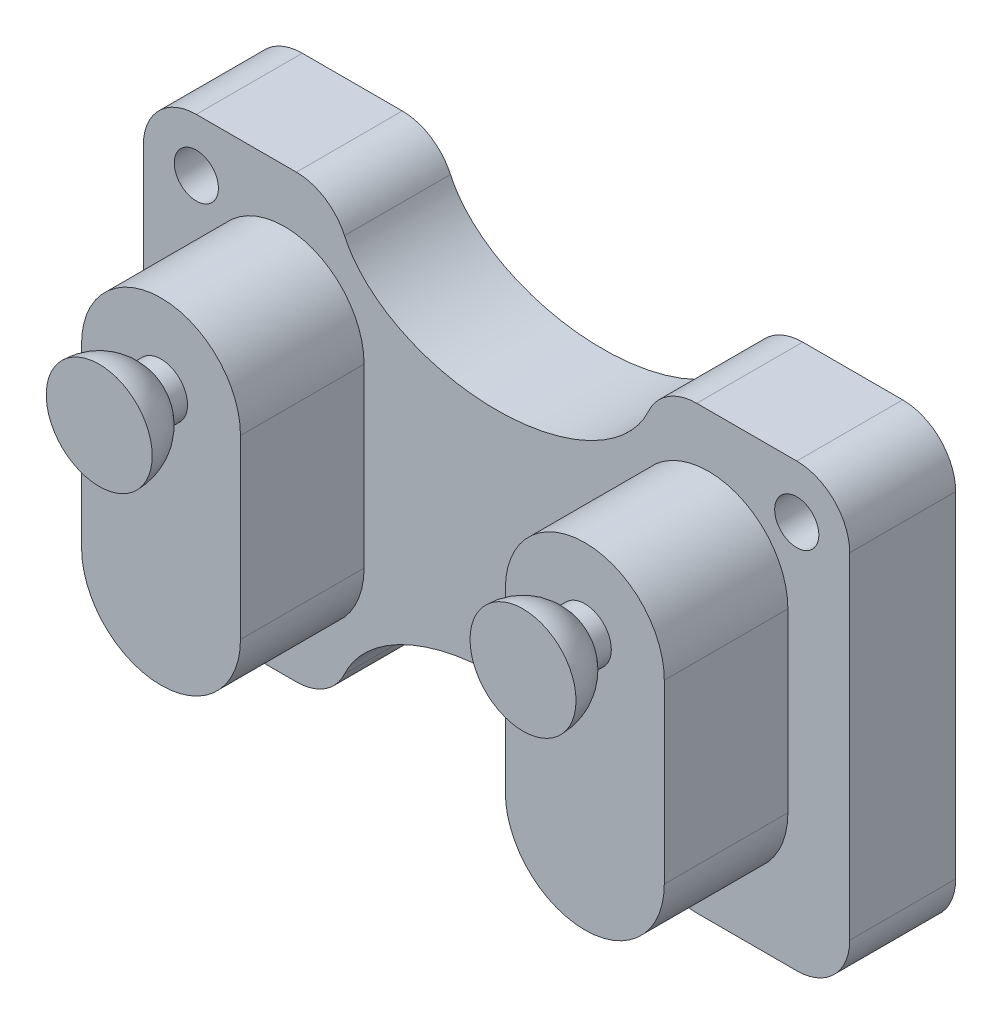
ISO-10303-21;
HEADER;
FILE_DESCRIPTION(('STEP AP214'),'2;1');
FILE_NAME('part.step','',(''),(''),'','','');
FILE_SCHEMA(('AUTOMOTIVE_DESIGN { 1 0 10303 214 1 1 1 1 }'));
ENDSEC;
DATA;
#1=APPLICATION_CONTEXT('core data for automotive mechanical design processes');
#2=APPLICATION_PROTOCOL_DEFINITION('international standard','automotive_design',2000,#1);
#3=PRODUCT_CONTEXT('',#1,'mechanical');
#4=PRODUCT('Part','Part','',(#3));
#5=PRODUCT_RELATED_PRODUCT_CATEGORY('part','',(#4));
#6=PRODUCT_DEFINITION_FORMATION('','',#4);
#7=PRODUCT_DEFINITION_CONTEXT('part definition',#1,'design');
#8=PRODUCT_DEFINITION('design','',#6,#7);
#9=PRODUCT_DEFINITION_SHAPE('','',#8);
#10=(LENGTH_UNIT() NAMED_UNIT(*) SI_UNIT(.MILLI.,.METRE.));
#11=(NAMED_UNIT(*) PLANE_ANGLE_UNIT() SI_UNIT($,.RADIAN.));
#12=(NAMED_UNIT(*) SI_UNIT($,.STERADIAN.) SOLID_ANGLE_UNIT());
#13=UNCERTAINTY_MEASURE_WITH_UNIT(LENGTH_MEASURE(1.E-05),#10,'distance_accuracy_value','');
#14=(GEOMETRIC_REPRESENTATION_CONTEXT(3) GLOBAL_UNCERTAINTY_ASSIGNED_CONTEXT((#13)) GLOBAL_UNIT_ASSIGNED_CONTEXT((#10,
#11,#12)) REPRESENTATION_CONTEXT('',''));
#15=CARTESIAN_POINT('',(0.,0.,0.));
#16=DIRECTION('',(0.,0.,1.));
#17=DIRECTION('',(1.,0.,0.));
#18=AXIS2_PLACEMENT_3D('',#15,#16,#17);
#19=CARTESIAN_POINT('',(0.,25.,6.));
#20=DIRECTION('',(0.,-1.,0.));
#21=DIRECTION('',(0.,0.,-1.));
#22=AXIS2_PLACEMENT_3D('',#19,#20,#21);
#23=PLANE('',#22);
#24=DIRECTION('',(-1.,0.,0.));
#25=VECTOR('',#24,1.);
#26=CARTESIAN_POINT('',(0.,25.,6.));
#27=LINE('',#26,#25);
#28=CARTESIAN_POINT('',(8.6641411243451,25.,6.));
#29=VERTEX_POINT('',#28);
#30=CARTESIAN_POINT('',(3.00000000000001,25.,6.));
#31=VERTEX_POINT('',#30);
#32=EDGE_CURVE('E284',#29,#31,#27,.T.);
#33=ORIENTED_EDGE('',*,*,#32,.F.);
#34=DIRECTION('',(0.,0.,-1.));
#35=VECTOR('',#34,1.);
#36=CARTESIAN_POINT('',(8.6641411243451,25.,0.));
#37=LINE('',#36,#35);
#38=CARTESIAN_POINT('',(8.6641411243451,25.,0.));
#39=VERTEX_POINT('',#38);
#40=EDGE_CURVE('E11',#29,#39,#37,.T.);
#41=ORIENTED_EDGE('',*,*,#40,.T.);
#42=DIRECTION('',(-1.,0.,0.));
#43=VECTOR('',#42,1.);
#44=CARTESIAN_POINT('',(0.,25.,0.));
#45=LINE('',#44,#43);
#46=CARTESIAN_POINT('',(3.00000000000001,25.,0.));
#47=VERTEX_POINT('',#46);
#48=EDGE_CURVE('E297',#39,#47,#45,.T.);
#49=ORIENTED_EDGE('',*,*,#48,.T.);
#50=DIRECTION('',(0.,0.,-1.));
#51=VECTOR('',#50,1.);
#52=CARTESIAN_POINT('',(3.00000000000001,25.,6.));
#53=LINE('',#52,#51);
#54=EDGE_CURVE('E342',#47,#31,#53,.F.);
#55=ORIENTED_EDGE('',*,*,#54,.T.);
#56=EDGE_LOOP('',(#33,#41,#49,#55));
#57=FACE_BOUND('',#56,.T.);
#58=ADVANCED_FACE('F32',(#57),#23,.F.);
#59=CARTESIAN_POINT('',(37.,25.,0.));
#60=VERTEX_POINT('',#59);
#61=CARTESIAN_POINT('',(31.3358588756549,25.,0.));
#62=VERTEX_POINT('',#61);
#63=EDGE_CURVE('E277',#60,#62,#45,.T.);
#64=ORIENTED_EDGE('',*,*,#63,.T.);
#65=DIRECTION('',(0.,0.,-1.));
#66=VECTOR('',#65,1.);
#67=CARTESIAN_POINT('',(31.3358588756549,25.,6.));
#68=LINE('',#67,#66);
#69=CARTESIAN_POINT('',(31.3358588756549,25.,6.));
#70=VERTEX_POINT('',#69);
#71=EDGE_CURVE('E55',#62,#70,#68,.F.);
#72=ORIENTED_EDGE('',*,*,#71,.T.);
#73=CARTESIAN_POINT('',(37.,25.,6.));
#74=VERTEX_POINT('',#73);
#75=EDGE_CURVE('E285',#74,#70,#27,.T.);
#76=ORIENTED_EDGE('',*,*,#75,.F.);
#77=DIRECTION('',(0.,0.,-1.));
#78=VECTOR('',#77,1.);
#79=CARTESIAN_POINT('',(37.,25.,6.));
#80=LINE('',#79,#78);
#81=EDGE_CURVE('E345',#74,#60,#80,.T.);
#82=ORIENTED_EDGE('',*,*,#81,.T.);
#83=EDGE_LOOP('',(#64,#72,#76,#82));
#84=FACE_BOUND('',#83,.T.);
#85=ADVANCED_FACE('F401',(#84),#23,.F.);
#86=CARTESIAN_POINT('',(0.,0.,6.));
#87=DIRECTION('',(0.,1.,0.));
#88=DIRECTION('',(0.,0.,1.));
#89=AXIS2_PLACEMENT_3D('',#86,#87,#88);
#90=PLANE('',#89);
#91=DIRECTION('',(1.,0.,0.));
#92=VECTOR('',#91,1.);
#93=CARTESIAN_POINT('',(0.,0.,0.));
#94=LINE('',#93,#92);
#95=CARTESIAN_POINT('',(3.,0.,0.));
#96=VERTEX_POINT('',#95);
#97=CARTESIAN_POINT('',(8.6641411243451,0.,0.));
#98=VERTEX_POINT('',#97);
#99=EDGE_CURVE('E291',#96,#98,#94,.T.);
#100=ORIENTED_EDGE('',*,*,#99,.T.);
#101=DIRECTION('',(0.,0.,1.));
#102=VECTOR('',#101,1.);
#103=CARTESIAN_POINT('',(8.6641411243451,0.,6.));
#104=LINE('',#103,#102);
#105=CARTESIAN_POINT('',(8.6641411243451,0.,6.));
#106=VERTEX_POINT('',#105);
#107=EDGE_CURVE('E366',#98,#106,#104,.T.);
#108=ORIENTED_EDGE('',*,*,#107,.T.);
#109=DIRECTION('',(1.,0.,0.));
#110=VECTOR('',#109,1.);
#111=CARTESIAN_POINT('',(0.,0.,6.));
#112=LINE('',#111,#110);
#113=CARTESIAN_POINT('',(3.,0.,6.));
#114=VERTEX_POINT('',#113);
#115=EDGE_CURVE('E278',#114,#106,#112,.T.);
#116=ORIENTED_EDGE('',*,*,#115,.F.);
#117=DIRECTION('',(0.,0.,-1.));
#118=VECTOR('',#117,1.);
#119=CARTESIAN_POINT('',(3.,0.,6.));
#120=LINE('',#119,#118);
#121=EDGE_CURVE('E311',#114,#96,#120,.T.);
#122=ORIENTED_EDGE('',*,*,#121,.T.);
#123=EDGE_LOOP('',(#100,#108,#116,#122));
#124=FACE_BOUND('',#123,.T.);
#125=ADVANCED_FACE('F509',(#124),#90,.F.);
#126=CARTESIAN_POINT('',(0.,0.,6.));
#127=DIRECTION('',(0.,0.,-1.));
#128=DIRECTION('',(-1.,0.,0.));
#129=AXIS2_PLACEMENT_3D('',#126,#127,#128);
#130=PLANE('',#129);
#131=CARTESIAN_POINT('',(37.0000000000003,21.9999999999998,6.));
#132=DIRECTION('',(0.,0.,-1.));
#133=DIRECTION('',(-1.,0.,0.));
#134=AXIS2_PLACEMENT_3D('',#131,#132,#133);
#135=CIRCLE('',#134,1.25);
#136=CARTESIAN_POINT('',(35.7500000000003,21.9999999999998,6.));
#137=VERTEX_POINT('',#136);
#138=EDGE_CURVE('E714',#137,#137,#135,.T.);
#139=ORIENTED_EDGE('',*,*,#138,.T.);
#140=EDGE_LOOP('',(#139));
#141=FACE_BOUND('',#140,.T.);
#142=CARTESIAN_POINT('',(3.00000000000001,22.,6.));
#143=DIRECTION('',(0.,0.,1.));
#144=DIRECTION('',(1.,0.,0.));
#145=AXIS2_PLACEMENT_3D('',#142,#143,#144);
#146=CIRCLE('',#145,1.25);
#147=CARTESIAN_POINT('',(4.25000000000001,22.,6.));
#148=VERTEX_POINT('',#147);
#149=EDGE_CURVE('E718',#148,#148,#146,.T.);
#150=ORIENTED_EDGE('',*,*,#149,.F.);
#151=EDGE_LOOP('',(#150));
#152=FACE_BOUND('',#151,.T.);
#153=ORIENTED_EDGE('',*,*,#75,.T.);
#154=CARTESIAN_POINT('',(31.3358588756549,22.,6.));
#155=DIRECTION('',(0.,0.,-1.));
#156=DIRECTION('',(-1.,0.,0.));
#157=AXIS2_PLACEMENT_3D('',#154,#155,#156);
#158=CIRCLE('',#157,3.);
#159=CARTESIAN_POINT('',(28.6080765639452,23.24868076782,6.));
#160=VERTEX_POINT('',#159);
#161=EDGE_CURVE('E40',#70,#160,#158,.F.);
#162=ORIENTED_EDGE('',*,*,#161,.T.);
#163=CARTESIAN_POINT('',(20.,25.,6.));
#164=DIRECTION('',(0.,0.,-1.));
#165=DIRECTION('',(-1.,0.,0.));
#166=AXIS2_PLACEMENT_3D('',#163,#164,#165);
#167=ELLIPSE('',#166,9.,6.);
#168=CARTESIAN_POINT('',(11.3919234360548,23.24868076782,6.));
#169=VERTEX_POINT('',#168);
#170=EDGE_CURVE('E387',#160,#169,#167,.T.);
#171=ORIENTED_EDGE('',*,*,#170,.T.);
#172=CARTESIAN_POINT('',(8.6641411243451,22.,6.));
#173=DIRECTION('',(0.,0.,-1.));
#174=DIRECTION('',(-1.,0.,0.));
#175=AXIS2_PLACEMENT_3D('',#172,#173,#174);
#176=CIRCLE('',#175,3.);
#177=EDGE_CURVE('E47',#169,#29,#176,.F.);
#178=ORIENTED_EDGE('',*,*,#177,.T.);
#179=ORIENTED_EDGE('',*,*,#32,.T.);
#180=CARTESIAN_POINT('',(3.00000000000001,22.,6.));
#181=DIRECTION('',(0.,0.,-1.));
#182=DIRECTION('',(-1.,0.,0.));
#183=AXIS2_PLACEMENT_3D('',#180,#181,#182);
#184=CIRCLE('',#183,3.);
#185=CARTESIAN_POINT('',(0.,22.,6.));
#186=VERTEX_POINT('',#185);
#187=EDGE_CURVE('E329',#31,#186,#184,.F.);
#188=ORIENTED_EDGE('',*,*,#187,.T.);
#189=DIRECTION('',(0.,-1.,0.));
#190=VECTOR('',#189,1.);
#191=CARTESIAN_POINT('',(0.,0.,6.));
#192=LINE('',#191,#190);
#193=CARTESIAN_POINT('',(0.,3.,6.));
#194=VERTEX_POINT('',#193);
#195=EDGE_CURVE('E273',#186,#194,#192,.T.);
#196=ORIENTED_EDGE('',*,*,#195,.T.);
#197=CARTESIAN_POINT('',(3.,3.,6.));
#198=DIRECTION('',(0.,0.,-1.));
#199=DIRECTION('',(-1.,0.,0.));
#200=AXIS2_PLACEMENT_3D('',#197,#198,#199);
#201=CIRCLE('',#200,3.);
#202=EDGE_CURVE('E335',#194,#114,#201,.F.);
#203=ORIENTED_EDGE('',*,*,#202,.T.);
#204=ORIENTED_EDGE('',*,*,#115,.T.);
#205=CARTESIAN_POINT('',(8.6641411243451,2.99999999999995,6.));
#206=DIRECTION('',(0.,0.,-1.));
#207=DIRECTION('',(-1.,0.,0.));
#208=AXIS2_PLACEMENT_3D('',#205,#206,#207);
#209=CIRCLE('',#208,3.);
#210=CARTESIAN_POINT('',(11.3919234360548,1.75131923218001,6.));
#211=VERTEX_POINT('',#210);
#212=EDGE_CURVE('E362',#106,#211,#209,.F.);
#213=ORIENTED_EDGE('',*,*,#212,.T.);
#214=CARTESIAN_POINT('',(20.,0.,6.));
#215=DIRECTION('',(0.,0.,1.));
#216=DIRECTION('',(-1.,0.,0.));
#217=AXIS2_PLACEMENT_3D('',#214,#215,#216);
#218=ELLIPSE('',#217,9.,6.);
#219=CARTESIAN_POINT('',(28.6080765639452,1.75131923218001,6.));
#220=VERTEX_POINT('',#219);
#221=EDGE_CURVE('E394',#220,#211,#218,.T.);
#222=ORIENTED_EDGE('',*,*,#221,.F.);
#223=CARTESIAN_POINT('',(31.3358588756549,2.99999999999996,6.));
#224=DIRECTION('',(0.,0.,-1.));
#225=DIRECTION('',(-1.,0.,0.));
#226=AXIS2_PLACEMENT_3D('',#223,#224,#225);
#227=CIRCLE('',#226,3.);
#228=CARTESIAN_POINT('',(31.3358588756549,0.,6.));
#229=VERTEX_POINT('',#228);
#230=EDGE_CURVE('E364',#220,#229,#227,.F.);
#231=ORIENTED_EDGE('',*,*,#230,.T.);
#232=CARTESIAN_POINT('',(37.,0.,6.));
#233=VERTEX_POINT('',#232);
#234=EDGE_CURVE('E276',#229,#233,#112,.T.);
#235=ORIENTED_EDGE('',*,*,#234,.T.);
#236=CARTESIAN_POINT('',(37.,3.,6.));
#237=DIRECTION('',(0.,0.,-1.));
#238=DIRECTION('',(-1.,0.,0.));
#239=AXIS2_PLACEMENT_3D('',#236,#237,#238);
#240=CIRCLE('',#239,3.);
#241=CARTESIAN_POINT('',(40.,3.,6.));
#242=VERTEX_POINT('',#241);
#243=EDGE_CURVE('E333',#233,#242,#240,.F.);
#244=ORIENTED_EDGE('',*,*,#243,.T.);
#245=DIRECTION('',(0.,1.,0.));
#246=VECTOR('',#245,1.);
#247=CARTESIAN_POINT('',(40.,0.,6.));
#248=LINE('',#247,#246);
#249=CARTESIAN_POINT('',(40.,22.,6.));
#250=VERTEX_POINT('',#249);
#251=EDGE_CURVE('E281',#242,#250,#248,.T.);
#252=ORIENTED_EDGE('',*,*,#251,.T.);
#253=CARTESIAN_POINT('',(37.,22.,6.));
#254=DIRECTION('',(0.,0.,-1.));
#255=DIRECTION('',(-1.,0.,0.));
#256=AXIS2_PLACEMENT_3D('',#253,#254,#255);
#257=CIRCLE('',#256,3.);
#258=EDGE_CURVE('E331',#250,#74,#257,.F.);
#259=ORIENTED_EDGE('',*,*,#258,.T.);
#260=EDGE_LOOP('',(#153,#162,#171,#178,#179,#188,#196,#203,#204,#213,#222,#231,#235,#244,#252,#259));
#261=FACE_BOUND('',#260,.T.);
#262=DIRECTION('',(0.,1.,0.));
#263=VECTOR('',#262,1.);
#264=CARTESIAN_POINT('',(27.5000000000002,17.4999999999999,6.));
#265=LINE('',#264,#263);
#266=CARTESIAN_POINT('',(27.5000000000001,7.49999999999991,6.));
#267=VERTEX_POINT('',#266);
#268=CARTESIAN_POINT('',(27.5000000000002,17.4999999999999,6.));
#269=VERTEX_POINT('',#268);
#270=EDGE_CURVE('E227',#267,#269,#265,.T.);
#271=ORIENTED_EDGE('',*,*,#270,.T.);
#272=CARTESIAN_POINT('',(32.0000000000002,17.4999999999999,6.));
#273=DIRECTION('',(0.,0.,-1.));
#274=DIRECTION('',(-1.,0.,0.));
#275=AXIS2_PLACEMENT_3D('',#272,#273,#274);
#276=CIRCLE('',#275,4.5);
#277=CARTESIAN_POINT('',(36.5000000000002,17.4999999999998,6.));
#278=VERTEX_POINT('',#277);
#279=EDGE_CURVE('E200',#269,#278,#276,.T.);
#280=ORIENTED_EDGE('',*,*,#279,.T.);
#281=DIRECTION('',(0.,-1.,0.));
#282=VECTOR('',#281,1.);
#283=CARTESIAN_POINT('',(36.5000000000002,17.4999999999998,6.));
#284=LINE('',#283,#282);
#285=CARTESIAN_POINT('',(36.5000000000001,7.49999999999979,6.));
#286=VERTEX_POINT('',#285);
#287=EDGE_CURVE('E216',#278,#286,#284,.T.);
#288=ORIENTED_EDGE('',*,*,#287,.T.);
#289=CARTESIAN_POINT('',(32.0000000000001,7.49999999999985,6.));
#290=DIRECTION('',(0.,0.,-1.));
#291=DIRECTION('',(-1.,0.,0.));
#292=AXIS2_PLACEMENT_3D('',#289,#290,#291);
#293=CIRCLE('',#292,4.5);
#294=EDGE_CURVE('E230',#286,#267,#293,.T.);
#295=ORIENTED_EDGE('',*,*,#294,.T.);
#296=EDGE_LOOP('',(#271,#280,#288,#295));
#297=FACE_BOUND('',#296,.T.);
#298=CARTESIAN_POINT('',(8.00000000000002,17.5,6.));
#299=DIRECTION('',(0.,0.,1.));
#300=DIRECTION('',(1.,0.,0.));
#301=AXIS2_PLACEMENT_3D('',#298,#299,#300);
#302=CIRCLE('',#301,4.5);
#303=CARTESIAN_POINT('',(12.5,17.5,6.));
#304=VERTEX_POINT('',#303);
#305=CARTESIAN_POINT('',(3.50000000000002,17.5,6.));
#306=VERTEX_POINT('',#305);
#307=EDGE_CURVE('E205',#304,#306,#302,.T.);
#308=ORIENTED_EDGE('',*,*,#307,.F.);
#309=DIRECTION('',(0.,1.,0.));
#310=VECTOR('',#309,1.);
#311=CARTESIAN_POINT('',(12.5,17.5,6.));
#312=LINE('',#311,#310);
#313=CARTESIAN_POINT('',(12.5,7.5,6.));
#314=VERTEX_POINT('',#313);
#315=EDGE_CURVE('E244',#314,#304,#312,.T.);
#316=ORIENTED_EDGE('',*,*,#315,.F.);
#317=CARTESIAN_POINT('',(8.00000000000003,7.5,6.));
#318=DIRECTION('',(0.,0.,1.));
#319=DIRECTION('',(1.,0.,0.));
#320=AXIS2_PLACEMENT_3D('',#317,#318,#319);
#321=CIRCLE('',#320,4.5);
#322=CARTESIAN_POINT('',(3.50000000000003,7.5,6.));
#323=VERTEX_POINT('',#322);
#324=EDGE_CURVE('E256',#323,#314,#321,.T.);
#325=ORIENTED_EDGE('',*,*,#324,.F.);
#326=DIRECTION('',(0.,-1.,0.));
#327=VECTOR('',#326,1.);
#328=CARTESIAN_POINT('',(3.50000000000002,17.5,6.));
#329=LINE('',#328,#327);
#330=EDGE_CURVE('E253',#306,#323,#329,.T.);
#331=ORIENTED_EDGE('',*,*,#330,.F.);
#332=EDGE_LOOP('',(#308,#316,#325,#331));
#333=FACE_BOUND('',#332,.T.);
#334=ADVANCED_FACE('F385',(#141,#152,#261,#297,#333),#130,.F.);
#335=CARTESIAN_POINT('',(0.,0.,6.));
#336=DIRECTION('',(1.,0.,0.));
#337=DIRECTION('',(0.,1.,0.));
#338=AXIS2_PLACEMENT_3D('',#335,#336,#337);
#339=PLANE('',#338);
#340=DIRECTION('',(0.,-1.,0.));
#341=VECTOR('',#340,1.);
#342=CARTESIAN_POINT('',(0.,0.,0.));
#343=LINE('',#342,#341);
#344=CARTESIAN_POINT('',(0.,22.,0.));
#345=VERTEX_POINT('',#344);
#346=CARTESIAN_POINT('',(0.,3.,0.));
#347=VERTEX_POINT('',#346);
#348=EDGE_CURVE('E272',#345,#347,#343,.T.);
#349=ORIENTED_EDGE('',*,*,#348,.T.);
#350=DIRECTION('',(0.,0.,-1.));
#351=VECTOR('',#350,1.);
#352=CARTESIAN_POINT('',(0.,3.,6.));
#353=LINE('',#352,#351);
#354=EDGE_CURVE('E327',#347,#194,#353,.F.);
#355=ORIENTED_EDGE('',*,*,#354,.T.);
#356=ORIENTED_EDGE('',*,*,#195,.F.);
#357=DIRECTION('',(0.,0.,-1.));
#358=VECTOR('',#357,1.);
#359=CARTESIAN_POINT('',(0.,22.,6.));
#360=LINE('',#359,#358);
#361=EDGE_CURVE('E324',#186,#345,#360,.T.);
#362=ORIENTED_EDGE('',*,*,#361,.T.);
#363=EDGE_LOOP('',(#349,#355,#356,#362));
#364=FACE_BOUND('',#363,.T.);
#365=ADVANCED_FACE('F508',(#364),#339,.F.);
#366=ORIENTED_EDGE('',*,*,#234,.F.);
#367=DIRECTION('',(0.,0.,1.));
#368=VECTOR('',#367,1.);
#369=CARTESIAN_POINT('',(31.3358588756549,0.,6.));
#370=LINE('',#369,#368);
#371=CARTESIAN_POINT('',(31.3358588756549,0.,0.));
#372=VERTEX_POINT('',#371);
#373=EDGE_CURVE('E351',#229,#372,#370,.F.);
#374=ORIENTED_EDGE('',*,*,#373,.T.);
#375=CARTESIAN_POINT('',(37.,0.,0.));
#376=VERTEX_POINT('',#375);
#377=EDGE_CURVE('E290',#372,#376,#94,.T.);
#378=ORIENTED_EDGE('',*,*,#377,.T.);
#379=DIRECTION('',(0.,0.,-1.));
#380=VECTOR('',#379,1.);
#381=CARTESIAN_POINT('',(37.,0.,6.));
#382=LINE('',#381,#380);
#383=EDGE_CURVE('E308',#376,#233,#382,.F.);
#384=ORIENTED_EDGE('',*,*,#383,.T.);
#385=EDGE_LOOP('',(#366,#374,#378,#384));
#386=FACE_BOUND('',#385,.T.);
#387=ADVANCED_FACE('F420',(#386),#90,.F.);
#388=CARTESIAN_POINT('',(40.,0.,6.));
#389=DIRECTION('',(-1.,0.,0.));
#390=DIRECTION('',(0.,-1.,0.));
#391=AXIS2_PLACEMENT_3D('',#388,#389,#390);
#392=PLANE('',#391);
#393=ORIENTED_EDGE('',*,*,#251,.F.);
#394=DIRECTION('',(0.,0.,-1.));
#395=VECTOR('',#394,1.);
#396=CARTESIAN_POINT('',(40.,3.,6.));
#397=LINE('',#396,#395);
#398=CARTESIAN_POINT('',(40.,3.,0.));
#399=VERTEX_POINT('',#398);
#400=EDGE_CURVE('E339',#242,#399,#397,.T.);
#401=ORIENTED_EDGE('',*,*,#400,.T.);
#402=DIRECTION('',(0.,1.,0.));
#403=VECTOR('',#402,1.);
#404=CARTESIAN_POINT('',(40.,0.,0.));
#405=LINE('',#404,#403);
#406=CARTESIAN_POINT('',(40.,22.,0.));
#407=VERTEX_POINT('',#406);
#408=EDGE_CURVE('E294',#399,#407,#405,.T.);
#409=ORIENTED_EDGE('',*,*,#408,.T.);
#410=DIRECTION('',(0.,0.,-1.));
#411=VECTOR('',#410,1.);
#412=CARTESIAN_POINT('',(40.,22.,6.));
#413=LINE('',#412,#411);
#414=EDGE_CURVE('E337',#407,#250,#413,.F.);
#415=ORIENTED_EDGE('',*,*,#414,.T.);
#416=EDGE_LOOP('',(#393,#401,#409,#415));
#417=FACE_BOUND('',#416,.T.);
#418=ADVANCED_FACE('F410',(#417),#392,.F.);
#419=CARTESIAN_POINT('',(0.,0.,0.));
#420=DIRECTION('',(0.,0.,-1.));
#421=DIRECTION('',(-1.,0.,0.));
#422=AXIS2_PLACEMENT_3D('',#419,#420,#421);
#423=PLANE('',#422);
#424=CARTESIAN_POINT('',(37.0000000000003,21.9999999999998,0.));
#425=DIRECTION('',(0.,0.,-1.));
#426=DIRECTION('',(-1.,0.,0.));
#427=AXIS2_PLACEMENT_3D('',#424,#425,#426);
#428=CIRCLE('',#427,1.25);
#429=CARTESIAN_POINT('',(35.7500000000003,21.9999999999998,0.));
#430=VERTEX_POINT('',#429);
#431=EDGE_CURVE('E717',#430,#430,#428,.T.);
#432=ORIENTED_EDGE('',*,*,#431,.F.);
#433=EDGE_LOOP('',(#432));
#434=FACE_BOUND('',#433,.T.);
#435=CARTESIAN_POINT('',(3.00000000000001,22.,0.));
#436=DIRECTION('',(0.,0.,-1.));
#437=DIRECTION('',(-1.,0.,0.));
#438=AXIS2_PLACEMENT_3D('',#435,#436,#437);
#439=CIRCLE('',#438,1.25);
#440=CARTESIAN_POINT('',(1.75,22.,0.));
#441=VERTEX_POINT('',#440);
#442=EDGE_CURVE('E395',#441,#441,#439,.F.);
#443=ORIENTED_EDGE('',*,*,#442,.T.);
#444=EDGE_LOOP('',(#443));
#445=FACE_BOUND('',#444,.T.);
#446=CARTESIAN_POINT('',(20.,25.,0.));
#447=DIRECTION('',(0.,0.,-1.));
#448=DIRECTION('',(-1.,0.,0.));
#449=AXIS2_PLACEMENT_3D('',#446,#447,#448);
#450=ELLIPSE('',#449,9.,6.);
#451=CARTESIAN_POINT('',(11.3919234360548,23.24868076782,0.));
#452=VERTEX_POINT('',#451);
#453=CARTESIAN_POINT('',(28.6080765639452,23.24868076782,0.));
#454=VERTEX_POINT('',#453);
#455=EDGE_CURVE('E369',#452,#454,#450,.F.);
#456=ORIENTED_EDGE('',*,*,#455,.T.);
#457=CARTESIAN_POINT('',(31.3358588756549,22.,0.));
#458=DIRECTION('',(0.,0.,-1.));
#459=DIRECTION('',(-1.,0.,0.));
#460=AXIS2_PLACEMENT_3D('',#457,#458,#459);
#461=CIRCLE('',#460,3.);
#462=EDGE_CURVE('E380',#454,#62,#461,.T.);
#463=ORIENTED_EDGE('',*,*,#462,.T.);
#464=ORIENTED_EDGE('',*,*,#63,.F.);
#465=CARTESIAN_POINT('',(37.,22.,0.));
#466=DIRECTION('',(0.,0.,-1.));
#467=DIRECTION('',(-1.,0.,0.));
#468=AXIS2_PLACEMENT_3D('',#465,#466,#467);
#469=CIRCLE('',#468,3.);
#470=EDGE_CURVE('E317',#60,#407,#469,.T.);
#471=ORIENTED_EDGE('',*,*,#470,.T.);
#472=ORIENTED_EDGE('',*,*,#408,.F.);
#473=CARTESIAN_POINT('',(37.,3.,0.));
#474=DIRECTION('',(0.,0.,-1.));
#475=DIRECTION('',(-1.,0.,0.));
#476=AXIS2_PLACEMENT_3D('',#473,#474,#475);
#477=CIRCLE('',#476,3.);
#478=EDGE_CURVE('E319',#399,#376,#477,.T.);
#479=ORIENTED_EDGE('',*,*,#478,.T.);
#480=ORIENTED_EDGE('',*,*,#377,.F.);
#481=CARTESIAN_POINT('',(31.3358588756549,2.99999999999996,0.));
#482=DIRECTION('',(0.,0.,-1.));
#483=DIRECTION('',(-1.,0.,0.));
#484=AXIS2_PLACEMENT_3D('',#481,#482,#483);
#485=CIRCLE('',#484,3.);
#486=CARTESIAN_POINT('',(28.6080765639452,1.75131923218001,0.));
#487=VERTEX_POINT('',#486);
#488=EDGE_CURVE('E356',#372,#487,#485,.T.);
#489=ORIENTED_EDGE('',*,*,#488,.T.);
#490=CARTESIAN_POINT('',(20.,0.,0.));
#491=DIRECTION('',(0.,0.,1.));
#492=DIRECTION('',(-1.,0.,0.));
#493=AXIS2_PLACEMENT_3D('',#490,#491,#492);
#494=ELLIPSE('',#493,9.,6.);
#495=CARTESIAN_POINT('',(11.3919234360548,1.75131923218001,0.));
#496=VERTEX_POINT('',#495);
#497=EDGE_CURVE('E348',#496,#487,#494,.F.);
#498=ORIENTED_EDGE('',*,*,#497,.F.);
#499=CARTESIAN_POINT('',(8.6641411243451,2.99999999999995,0.));
#500=DIRECTION('',(0.,0.,-1.));
#501=DIRECTION('',(-1.,0.,0.));
#502=AXIS2_PLACEMENT_3D('',#499,#500,#501);
#503=CIRCLE('',#502,3.);
#504=EDGE_CURVE('E354',#496,#98,#503,.T.);
#505=ORIENTED_EDGE('',*,*,#504,.T.);
#506=ORIENTED_EDGE('',*,*,#99,.F.);
#507=CARTESIAN_POINT('',(3.,3.,0.));
#508=DIRECTION('',(0.,0.,-1.));
#509=DIRECTION('',(-1.,0.,0.));
#510=AXIS2_PLACEMENT_3D('',#507,#508,#509);
#511=CIRCLE('',#510,3.);
#512=EDGE_CURVE('E322',#96,#347,#511,.T.);
#513=ORIENTED_EDGE('',*,*,#512,.T.);
#514=ORIENTED_EDGE('',*,*,#348,.F.);
#515=CARTESIAN_POINT('',(3.00000000000001,22.,0.));
#516=DIRECTION('',(0.,0.,-1.));
#517=DIRECTION('',(-1.,0.,0.));
#518=AXIS2_PLACEMENT_3D('',#515,#516,#517);
#519=CIRCLE('',#518,3.);
#520=EDGE_CURVE('E314',#345,#47,#519,.T.);
#521=ORIENTED_EDGE('',*,*,#520,.T.);
#522=ORIENTED_EDGE('',*,*,#48,.F.);
#523=CARTESIAN_POINT('',(8.6641411243451,22.,0.));
#524=DIRECTION('',(0.,0.,-1.));
#525=DIRECTION('',(-1.,0.,0.));
#526=AXIS2_PLACEMENT_3D('',#523,#524,#525);
#527=CIRCLE('',#526,3.);
#528=EDGE_CURVE('E378',#39,#452,#527,.T.);
#529=ORIENTED_EDGE('',*,*,#528,.T.);
#530=EDGE_LOOP('',(#456,#463,#464,#471,#472,#479,#480,#489,#498,#505,#506,#513,#514,#521,#522,#529));
#531=FACE_BOUND('',#530,.T.);
#532=ADVANCED_FACE('F400',(#434,#445,#531),#423,.T.);
#533=CARTESIAN_POINT('',(8.00000000000002,17.5,13.));
#534=DIRECTION('',(0.,0.,-1.));
#535=DIRECTION('',(-1.,0.,0.));
#536=AXIS2_PLACEMENT_3D('',#533,#534,#535);
#537=CYLINDRICAL_SURFACE('',#536,4.5);
#538=ORIENTED_EDGE('',*,*,#307,.T.);
#539=DIRECTION('',(0.,0.,-1.));
#540=VECTOR('',#539,1.);
#541=CARTESIAN_POINT('',(3.50000000000002,17.5,13.));
#542=LINE('',#541,#540);
#543=CARTESIAN_POINT('',(3.50000000000002,17.5,13.));
#544=VERTEX_POINT('',#543);
#545=EDGE_CURVE('E269',#544,#306,#542,.T.);
#546=ORIENTED_EDGE('',*,*,#545,.F.);
#547=CARTESIAN_POINT('',(8.00000000000002,17.5,13.));
#548=DIRECTION('',(0.,0.,1.));
#549=DIRECTION('',(1.,0.,0.));
#550=AXIS2_PLACEMENT_3D('',#547,#548,#549);
#551=CIRCLE('',#550,4.5);
#552=CARTESIAN_POINT('',(12.5,17.5,13.));
#553=VERTEX_POINT('',#552);
#554=EDGE_CURVE('E240',#553,#544,#551,.T.);
#555=ORIENTED_EDGE('',*,*,#554,.F.);
#556=DIRECTION('',(0.,0.,-1.));
#557=VECTOR('',#556,1.);
#558=CARTESIAN_POINT('',(12.5,17.5,13.));
#559=LINE('',#558,#557);
#560=EDGE_CURVE('E250',#553,#304,#559,.T.);
#561=ORIENTED_EDGE('',*,*,#560,.T.);
#562=EDGE_LOOP('',(#538,#546,#555,#561));
#563=FACE_BOUND('',#562,.T.);
#564=ADVANCED_FACE('F501',(#563),#537,.T.);
#565=CARTESIAN_POINT('',(3.50000000000002,17.5,13.));
#566=DIRECTION('',(1.,0.,0.));
#567=DIRECTION('',(0.,1.,0.));
#568=AXIS2_PLACEMENT_3D('',#565,#566,#567);
#569=PLANE('',#568);
#570=ORIENTED_EDGE('',*,*,#330,.T.);
#571=DIRECTION('',(0.,0.,-1.));
#572=VECTOR('',#571,1.);
#573=CARTESIAN_POINT('',(3.50000000000003,7.5,13.));
#574=LINE('',#573,#572);
#575=CARTESIAN_POINT('',(3.50000000000003,7.5,13.));
#576=VERTEX_POINT('',#575);
#577=EDGE_CURVE('E266',#576,#323,#574,.T.);
#578=ORIENTED_EDGE('',*,*,#577,.F.);
#579=DIRECTION('',(0.,-1.,0.));
#580=VECTOR('',#579,1.);
#581=CARTESIAN_POINT('',(3.50000000000002,17.5,13.));
#582=LINE('',#581,#580);
#583=EDGE_CURVE('E243',#544,#576,#582,.T.);
#584=ORIENTED_EDGE('',*,*,#583,.F.);
#585=ORIENTED_EDGE('',*,*,#545,.T.);
#586=EDGE_LOOP('',(#570,#578,#584,#585));
#587=FACE_BOUND('',#586,.T.);
#588=ADVANCED_FACE('F497',(#587),#569,.F.);
#589=CARTESIAN_POINT('',(8.00000000000003,7.5,13.));
#590=DIRECTION('',(0.,0.,-1.));
#591=DIRECTION('',(-1.,0.,0.));
#592=AXIS2_PLACEMENT_3D('',#589,#590,#591);
#593=CYLINDRICAL_SURFACE('',#592,4.5);
#594=ORIENTED_EDGE('',*,*,#324,.T.);
#595=DIRECTION('',(0.,0.,-1.));
#596=VECTOR('',#595,1.);
#597=CARTESIAN_POINT('',(12.5,7.5,13.));
#598=LINE('',#597,#596);
#599=CARTESIAN_POINT('',(12.5,7.5,13.));
#600=VERTEX_POINT('',#599);
#601=EDGE_CURVE('E263',#600,#314,#598,.T.);
#602=ORIENTED_EDGE('',*,*,#601,.F.);
#603=CARTESIAN_POINT('',(8.00000000000003,7.5,13.));
#604=DIRECTION('',(0.,0.,1.));
#605=DIRECTION('',(1.,0.,0.));
#606=AXIS2_PLACEMENT_3D('',#603,#604,#605);
#607=CIRCLE('',#606,4.5);
#608=EDGE_CURVE('E246',#576,#600,#607,.T.);
#609=ORIENTED_EDGE('',*,*,#608,.F.);
#610=ORIENTED_EDGE('',*,*,#577,.T.);
#611=EDGE_LOOP('',(#594,#602,#609,#610));
#612=FACE_BOUND('',#611,.T.);
#613=ADVANCED_FACE('F493',(#612),#593,.T.);
#614=CARTESIAN_POINT('',(12.5,17.5,13.));
#615=DIRECTION('',(-1.,0.,0.));
#616=DIRECTION('',(0.,-1.,0.));
#617=AXIS2_PLACEMENT_3D('',#614,#615,#616);
#618=PLANE('',#617);
#619=ORIENTED_EDGE('',*,*,#315,.T.);
#620=ORIENTED_EDGE('',*,*,#560,.F.);
#621=DIRECTION('',(0.,1.,0.));
#622=VECTOR('',#621,1.);
#623=CARTESIAN_POINT('',(12.5,17.5,13.));
#624=LINE('',#623,#622);
#625=EDGE_CURVE('E248',#600,#553,#624,.T.);
#626=ORIENTED_EDGE('',*,*,#625,.F.);
#627=ORIENTED_EDGE('',*,*,#601,.T.);
#628=EDGE_LOOP('',(#619,#620,#626,#627));
#629=FACE_BOUND('',#628,.T.);
#630=ADVANCED_FACE('F489',(#629),#618,.F.);
#631=CARTESIAN_POINT('',(8.00000000000002,17.5,13.));
#632=DIRECTION('',(0.,0.,1.));
#633=DIRECTION('',(1.,0.,0.));
#634=AXIS2_PLACEMENT_3D('',#631,#632,#633);
#635=PLANE('',#634);
#636=CARTESIAN_POINT('',(8.00000000000002,17.5,13.));
#637=DIRECTION('',(0.,0.,1.));
#638=DIRECTION('',(1.,0.,0.));
#639=AXIS2_PLACEMENT_3D('',#636,#637,#638);
#640=CIRCLE('',#639,1.49999999999999);
#641=CARTESIAN_POINT('',(9.50000000000002,17.5,13.));
#642=VERTEX_POINT('',#641);
#643=EDGE_CURVE('E228',#642,#642,#640,.T.);
#644=ORIENTED_EDGE('',*,*,#643,.F.);
#645=EDGE_LOOP('',(#644));
#646=FACE_BOUND('',#645,.T.);
#647=ORIENTED_EDGE('',*,*,#554,.T.);
#648=ORIENTED_EDGE('',*,*,#583,.T.);
#649=ORIENTED_EDGE('',*,*,#608,.T.);
#650=ORIENTED_EDGE('',*,*,#625,.T.);
#651=EDGE_LOOP('',(#647,#648,#649,#650));
#652=FACE_BOUND('',#651,.T.);
#653=ADVANCED_FACE('F486',(#646,#652),#635,.T.);
#654=CARTESIAN_POINT('',(32.0000000000002,17.4999999999999,13.));
#655=DIRECTION('',(0.,0.,-1.));
#656=DIRECTION('',(-1.,0.,0.));
#657=AXIS2_PLACEMENT_3D('',#654,#655,#656);
#658=CYLINDRICAL_SURFACE('',#657,4.5);
#659=ORIENTED_EDGE('',*,*,#279,.F.);
#660=DIRECTION('',(0.,0.,-1.));
#661=VECTOR('',#660,1.);
#662=CARTESIAN_POINT('',(27.5000000000002,17.4999999999999,13.));
#663=LINE('',#662,#661);
#664=CARTESIAN_POINT('',(27.5000000000002,17.4999999999999,13.));
#665=VERTEX_POINT('',#664);
#666=EDGE_CURVE('E194',#665,#269,#663,.T.);
#667=ORIENTED_EDGE('',*,*,#666,.F.);
#668=CARTESIAN_POINT('',(32.0000000000002,17.4999999999999,13.));
#669=DIRECTION('',(0.,0.,-1.));
#670=DIRECTION('',(-1.,0.,0.));
#671=AXIS2_PLACEMENT_3D('',#668,#669,#670);
#672=CIRCLE('',#671,4.5);
#673=CARTESIAN_POINT('',(36.5000000000002,17.4999999999998,13.));
#674=VERTEX_POINT('',#673);
#675=EDGE_CURVE('E197',#665,#674,#672,.T.);
#676=ORIENTED_EDGE('',*,*,#675,.T.);
#677=DIRECTION('',(0.,0.,-1.));
#678=VECTOR('',#677,1.);
#679=CARTESIAN_POINT('',(36.5000000000002,17.4999999999998,13.));
#680=LINE('',#679,#678);
#681=EDGE_CURVE('E225',#674,#278,#680,.T.);
#682=ORIENTED_EDGE('',*,*,#681,.T.);
#683=EDGE_LOOP('',(#659,#667,#676,#682));
#684=FACE_BOUND('',#683,.T.);
#685=ADVANCED_FACE('F196',(#684),#658,.T.);
#686=CARTESIAN_POINT('',(27.5000000000002,17.4999999999999,13.));
#687=DIRECTION('',(-1.,0.,0.));
#688=DIRECTION('',(0.,-1.,0.));
#689=AXIS2_PLACEMENT_3D('',#686,#687,#688);
#690=PLANE('',#689);
#691=ORIENTED_EDGE('',*,*,#270,.F.);
#692=DIRECTION('',(0.,0.,-1.));
#693=VECTOR('',#692,1.);
#694=CARTESIAN_POINT('',(27.5000000000001,7.49999999999991,13.));
#695=LINE('',#694,#693);
#696=CARTESIAN_POINT('',(27.5000000000001,7.49999999999991,13.));
#697=VERTEX_POINT('',#696);
#698=EDGE_CURVE('E206',#697,#267,#695,.T.);
#699=ORIENTED_EDGE('',*,*,#698,.F.);
#700=DIRECTION('',(0.,1.,0.));
#701=VECTOR('',#700,1.);
#702=CARTESIAN_POINT('',(27.5000000000002,17.4999999999999,13.));
#703=LINE('',#702,#701);
#704=EDGE_CURVE('E212',#697,#665,#703,.T.);
#705=ORIENTED_EDGE('',*,*,#704,.T.);
#706=ORIENTED_EDGE('',*,*,#666,.T.);
#707=EDGE_LOOP('',(#691,#699,#705,#706));
#708=FACE_BOUND('',#707,.T.);
#709=ADVANCED_FACE('F218',(#708),#690,.T.);
#710=CARTESIAN_POINT('',(32.0000000000001,7.49999999999985,13.));
#711=DIRECTION('',(0.,0.,-1.));
#712=DIRECTION('',(-1.,0.,0.));
#713=AXIS2_PLACEMENT_3D('',#710,#711,#712);
#714=CYLINDRICAL_SURFACE('',#713,4.5);
#715=ORIENTED_EDGE('',*,*,#294,.F.);
#716=DIRECTION('',(0.,0.,-1.));
#717=VECTOR('',#716,1.);
#718=CARTESIAN_POINT('',(36.5000000000001,7.49999999999979,13.));
#719=LINE('',#718,#717);
#720=CARTESIAN_POINT('',(36.5000000000001,7.49999999999979,13.));
#721=VERTEX_POINT('',#720);
#722=EDGE_CURVE('E236',#721,#286,#719,.T.);
#723=ORIENTED_EDGE('',*,*,#722,.F.);
#724=CARTESIAN_POINT('',(32.0000000000001,7.49999999999985,13.));
#725=DIRECTION('',(0.,0.,-1.));
#726=DIRECTION('',(-1.,0.,0.));
#727=AXIS2_PLACEMENT_3D('',#724,#725,#726);
#728=CIRCLE('',#727,4.5);
#729=EDGE_CURVE('E219',#721,#697,#728,.T.);
#730=ORIENTED_EDGE('',*,*,#729,.T.);
#731=ORIENTED_EDGE('',*,*,#698,.T.);
#732=EDGE_LOOP('',(#715,#723,#730,#731));
#733=FACE_BOUND('',#732,.T.);
#734=ADVANCED_FACE('F477',(#733),#714,.T.);
#735=CARTESIAN_POINT('',(36.5000000000002,17.4999999999998,13.));
#736=DIRECTION('',(1.,0.,0.));
#737=DIRECTION('',(0.,1.,0.));
#738=AXIS2_PLACEMENT_3D('',#735,#736,#737);
#739=PLANE('',#738);
#740=ORIENTED_EDGE('',*,*,#287,.F.);
#741=ORIENTED_EDGE('',*,*,#681,.F.);
#742=DIRECTION('',(0.,-1.,0.));
#743=VECTOR('',#742,1.);
#744=CARTESIAN_POINT('',(36.5000000000002,17.4999999999998,13.));
#745=LINE('',#744,#743);
#746=EDGE_CURVE('E215',#674,#721,#745,.T.);
#747=ORIENTED_EDGE('',*,*,#746,.T.);
#748=ORIENTED_EDGE('',*,*,#722,.T.);
#749=EDGE_LOOP('',(#740,#741,#747,#748));
#750=FACE_BOUND('',#749,.T.);
#751=ADVANCED_FACE('F473',(#750),#739,.T.);
#752=CARTESIAN_POINT('',(32.0000000000002,17.4999999999999,13.));
#753=DIRECTION('',(0.,0.,1.));
#754=DIRECTION('',(-1.,0.,0.));
#755=AXIS2_PLACEMENT_3D('',#752,#753,#754);
#756=PLANE('',#755);
#757=CARTESIAN_POINT('',(32.0000000000002,17.4999999999999,13.));
#758=DIRECTION('',(0.,0.,1.));
#759=DIRECTION('',(1.,0.,0.));
#760=AXIS2_PLACEMENT_3D('',#757,#758,#759);
#761=CIRCLE('',#760,1.49999999999999);
#762=CARTESIAN_POINT('',(33.5000000000002,17.4999999999999,13.));
#763=VERTEX_POINT('',#762);
#764=EDGE_CURVE('E287',#763,#763,#761,.T.);
#765=ORIENTED_EDGE('',*,*,#764,.F.);
#766=EDGE_LOOP('',(#765));
#767=FACE_BOUND('',#766,.T.);
#768=ORIENTED_EDGE('',*,*,#675,.F.);
#769=ORIENTED_EDGE('',*,*,#704,.F.);
#770=ORIENTED_EDGE('',*,*,#729,.F.);
#771=ORIENTED_EDGE('',*,*,#746,.F.);
#772=EDGE_LOOP('',(#768,#769,#770,#771));
#773=FACE_BOUND('',#772,.T.);
#774=ADVANCED_FACE('F210',(#767,#773),#756,.T.);
#775=CARTESIAN_POINT('',(8.00000000000002,17.5,16.5));
#776=DIRECTION('',(0.,0.,-1.));
#777=DIRECTION('',(-1.,0.,0.));
#778=AXIS2_PLACEMENT_3D('',#775,#776,#777);
#779=CYLINDRICAL_SURFACE('',#778,1.49999999999999);
#780=CARTESIAN_POINT('',(8.00000000000002,17.5,13.9019237886467));
#781=DIRECTION('',(0.,0.,1.));
#782=DIRECTION('',(1.,0.,0.));
#783=AXIS2_PLACEMENT_3D('',#780,#781,#782);
#784=CIRCLE('',#783,1.49999999999999);
#785=CARTESIAN_POINT('',(9.50000000000002,17.5,13.9019237886467));
#786=VERTEX_POINT('',#785);
#787=EDGE_CURVE('E302',#786,#786,#784,.F.);
#788=ORIENTED_EDGE('',*,*,#787,.T.);
#789=EDGE_LOOP('',(#788));
#790=FACE_BOUND('',#789,.T.);
#791=ORIENTED_EDGE('',*,*,#643,.T.);
#792=EDGE_LOOP('',(#791));
#793=FACE_BOUND('',#792,.T.);
#794=ADVANCED_FACE('F463',(#790,#793),#779,.T.);
#795=CARTESIAN_POINT('',(32.0000000000002,17.4999999999999,16.5));
#796=DIRECTION('',(0.,0.,-1.));
#797=DIRECTION('',(-1.,0.,0.));
#798=AXIS2_PLACEMENT_3D('',#795,#796,#797);
#799=CYLINDRICAL_SURFACE('',#798,1.49999999999999);
#800=CARTESIAN_POINT('',(32.0000000000002,17.4999999999999,13.9019237886467));
#801=DIRECTION('',(0.,0.,1.));
#802=DIRECTION('',(1.,0.,0.));
#803=AXIS2_PLACEMENT_3D('',#800,#801,#802);
#804=CIRCLE('',#803,1.49999999999999);
#805=CARTESIAN_POINT('',(33.5000000000002,17.4999999999999,13.9019237886467));
#806=VERTEX_POINT('',#805);
#807=EDGE_CURVE('E301',#806,#806,#804,.T.);
#808=ORIENTED_EDGE('',*,*,#807,.F.);
#809=EDGE_LOOP('',(#808));
#810=FACE_BOUND('',#809,.T.);
#811=ORIENTED_EDGE('',*,*,#764,.T.);
#812=EDGE_LOOP('',(#811));
#813=FACE_BOUND('',#812,.T.);
#814=ADVANCED_FACE('F455',(#810,#813),#799,.T.);
#815=CARTESIAN_POINT('',(8.00000000000002,17.5,16.5));
#816=DIRECTION('',(-1.,0.,0.));
#817=DIRECTION('',(0.,-1.,0.));
#818=AXIS2_PLACEMENT_3D('',#815,#816,#817);
#819=SPHERICAL_SURFACE('',#818,3.);
#820=CARTESIAN_POINT('',(8.00000000000002,17.5,16.5));
#821=DIRECTION('',(0.,0.,-1.));
#822=DIRECTION('',(1.,0.,0.));
#823=AXIS2_PLACEMENT_3D('',#820,#821,#822);
#824=SPHERICAL_SURFACE('',#823,3.);
#825=CARTESIAN_POINT('',(8.00000000000002,17.5,16.5));
#826=DIRECTION('',(0.,0.,-1.));
#827=DIRECTION('',(1.,0.,0.));
#828=AXIS2_PLACEMENT_3D('',#825,#826,#827);
#829=CIRCLE('',#828,3.);
#830=CARTESIAN_POINT('',(11.,17.5,16.5));
#831=VERTEX_POINT('',#830);
#832=EDGE_CURVE('E305',#831,#831,#829,.T.);
#833=ORIENTED_EDGE('',*,*,#832,.T.);
#834=EDGE_LOOP('',(#833));
#835=FACE_BOUND('',#834,.T.);
#836=ORIENTED_EDGE('',*,*,#787,.F.);
#837=EDGE_LOOP('',(#836));
#838=FACE_BOUND('',#837,.T.);
#839=ADVANCED_FACE('F452',(#835,#838),#824,.T.);
#840=CARTESIAN_POINT('',(8.00000000000002,17.5,16.5));
#841=DIRECTION('',(0.,0.,1.));
#842=DIRECTION('',(1.,0.,0.));
#843=AXIS2_PLACEMENT_3D('',#840,#841,#842);
#844=PLANE('',#843);
#845=ORIENTED_EDGE('',*,*,#832,.F.);
#846=EDGE_LOOP('',(#845));
#847=FACE_BOUND('',#846,.T.);
#848=ADVANCED_FACE('F450',(#847),#844,.T.);
#849=CARTESIAN_POINT('',(32.0000000000002,17.4999999999999,16.5));
#850=DIRECTION('',(1.,0.,0.));
#851=DIRECTION('',(0.,-1.,0.));
#852=AXIS2_PLACEMENT_3D('',#849,#850,#851);
#853=SPHERICAL_SURFACE('',#852,3.);
#854=CARTESIAN_POINT('',(32.0000000000002,17.4999999999999,16.5));
#855=DIRECTION('',(0.,0.,1.));
#856=DIRECTION('',(1.,0.,0.));
#857=AXIS2_PLACEMENT_3D('',#854,#855,#856);
#858=SPHERICAL_SURFACE('',#857,3.);
#859=ORIENTED_EDGE('',*,*,#807,.T.);
#860=EDGE_LOOP('',(#859));
#861=FACE_BOUND('',#860,.T.);
#862=CARTESIAN_POINT('',(32.0000000000002,17.4999999999999,16.5));
#863=DIRECTION('',(0.,0.,1.));
#864=DIRECTION('',(-1.,0.,0.));
#865=AXIS2_PLACEMENT_3D('',#862,#863,#864);
#866=CIRCLE('',#865,3.);
#867=CARTESIAN_POINT('',(29.0000000000002,17.4999999999999,16.5));
#868=VERTEX_POINT('',#867);
#869=EDGE_CURVE('E431',#868,#868,#866,.T.);
#870=ORIENTED_EDGE('',*,*,#869,.F.);
#871=EDGE_LOOP('',(#870));
#872=FACE_BOUND('',#871,.T.);
#873=ADVANCED_FACE('F446',(#861,#872),#858,.T.);
#874=CARTESIAN_POINT('',(32.0000000000002,17.4999999999999,16.5));
#875=DIRECTION('',(0.,0.,1.));
#876=DIRECTION('',(-1.,0.,0.));
#877=AXIS2_PLACEMENT_3D('',#874,#875,#876);
#878=PLANE('',#877);
#879=ORIENTED_EDGE('',*,*,#869,.T.);
#880=EDGE_LOOP('',(#879));
#881=FACE_BOUND('',#880,.T.);
#882=ADVANCED_FACE('F449',(#881),#878,.T.);
#883=CARTESIAN_POINT('',(3.,3.,6.));
#884=DIRECTION('',(0.,0.,-1.));
#885=DIRECTION('',(-1.,0.,0.));
#886=AXIS2_PLACEMENT_3D('',#883,#884,#885);
#887=CYLINDRICAL_SURFACE('',#886,3.);
#888=ORIENTED_EDGE('',*,*,#202,.F.);
#889=ORIENTED_EDGE('',*,*,#354,.F.);
#890=ORIENTED_EDGE('',*,*,#512,.F.);
#891=ORIENTED_EDGE('',*,*,#121,.F.);
#892=EDGE_LOOP('',(#888,#889,#890,#891));
#893=FACE_BOUND('',#892,.T.);
#894=ADVANCED_FACE('F459',(#893),#887,.T.);
#895=CARTESIAN_POINT('',(37.,3.,6.));
#896=DIRECTION('',(0.,0.,-1.));
#897=DIRECTION('',(-1.,0.,0.));
#898=AXIS2_PLACEMENT_3D('',#895,#896,#897);
#899=CYLINDRICAL_SURFACE('',#898,3.);
#900=ORIENTED_EDGE('',*,*,#243,.F.);
#901=ORIENTED_EDGE('',*,*,#383,.F.);
#902=ORIENTED_EDGE('',*,*,#478,.F.);
#903=ORIENTED_EDGE('',*,*,#400,.F.);
#904=EDGE_LOOP('',(#900,#901,#902,#903));
#905=FACE_BOUND('',#904,.T.);
#906=ADVANCED_FACE('F414',(#905),#899,.T.);
#907=CARTESIAN_POINT('',(37.,22.,6.));
#908=DIRECTION('',(0.,0.,-1.));
#909=DIRECTION('',(-1.,0.,0.));
#910=AXIS2_PLACEMENT_3D('',#907,#908,#909);
#911=CYLINDRICAL_SURFACE('',#910,3.);
#912=ORIENTED_EDGE('',*,*,#258,.F.);
#913=ORIENTED_EDGE('',*,*,#414,.F.);
#914=ORIENTED_EDGE('',*,*,#470,.F.);
#915=ORIENTED_EDGE('',*,*,#81,.F.);
#916=EDGE_LOOP('',(#912,#913,#914,#915));
#917=FACE_BOUND('',#916,.T.);
#918=ADVANCED_FACE('F405',(#917),#911,.T.);
#919=CARTESIAN_POINT('',(3.00000000000001,22.,6.));
#920=DIRECTION('',(0.,0.,-1.));
#921=DIRECTION('',(-1.,0.,0.));
#922=AXIS2_PLACEMENT_3D('',#919,#920,#921);
#923=CYLINDRICAL_SURFACE('',#922,3.);
#924=ORIENTED_EDGE('',*,*,#187,.F.);
#925=ORIENTED_EDGE('',*,*,#54,.F.);
#926=ORIENTED_EDGE('',*,*,#520,.F.);
#927=ORIENTED_EDGE('',*,*,#361,.F.);
#928=EDGE_LOOP('',(#924,#925,#926,#927));
#929=FACE_BOUND('',#928,.T.);
#930=ADVANCED_FACE('F444',(#929),#923,.T.);
#931=CARTESIAN_POINT('',(20.,0.,-21.6333076527839));
#932=DIRECTION('',(0.,0.,1.));
#933=DIRECTION('',(-1.,0.,0.));
#934=AXIS2_PLACEMENT_3D('',#931,#932,#933);
#935=ELLIPSE('',#934,9.,6.);
#936=DIRECTION('',(0.,0.,1.));
#937=VECTOR('',#936,1.);
#938=SURFACE_OF_LINEAR_EXTRUSION('',#935,#937);
#939=ORIENTED_EDGE('',*,*,#497,.T.);
#940=DIRECTION('',(0.,0.,1.));
#941=VECTOR('',#940,1.);
#942=CARTESIAN_POINT('',(28.6080765639452,1.75131923218002,0.));
#943=LINE('',#942,#941);
#944=EDGE_CURVE('E360',#487,#220,#943,.T.);
#945=ORIENTED_EDGE('',*,*,#944,.T.);
#946=ORIENTED_EDGE('',*,*,#221,.T.);
#947=DIRECTION('',(0.,0.,1.));
#948=VECTOR('',#947,1.);
#949=CARTESIAN_POINT('',(11.3919234360548,1.75131923218001,6.));
#950=LINE('',#949,#948);
#951=EDGE_CURVE('E358',#211,#496,#950,.F.);
#952=ORIENTED_EDGE('',*,*,#951,.T.);
#953=EDGE_LOOP('',(#939,#945,#946,#952));
#954=FACE_BOUND('',#953,.T.);
#955=ADVANCED_FACE('F429',(#954),#938,.F.);
#956=CARTESIAN_POINT('',(31.3358588756549,2.99999999999996,3.));
#957=DIRECTION('',(0.,0.,1.));
#958=DIRECTION('',(1.,0.,0.));
#959=AXIS2_PLACEMENT_3D('',#956,#957,#958);
#960=CYLINDRICAL_SURFACE('',#959,3.);
#961=ORIENTED_EDGE('',*,*,#230,.F.);
#962=ORIENTED_EDGE('',*,*,#944,.F.);
#963=ORIENTED_EDGE('',*,*,#488,.F.);
#964=ORIENTED_EDGE('',*,*,#373,.F.);
#965=EDGE_LOOP('',(#961,#962,#963,#964));
#966=FACE_BOUND('',#965,.T.);
#967=ADVANCED_FACE('F424',(#966),#960,.T.);
#968=CARTESIAN_POINT('',(8.6641411243451,2.99999999999995,3.));
#969=DIRECTION('',(0.,0.,1.));
#970=DIRECTION('',(1.,0.,0.));
#971=AXIS2_PLACEMENT_3D('',#968,#969,#970);
#972=CYLINDRICAL_SURFACE('',#971,3.);
#973=ORIENTED_EDGE('',*,*,#504,.F.);
#974=ORIENTED_EDGE('',*,*,#951,.F.);
#975=ORIENTED_EDGE('',*,*,#212,.F.);
#976=ORIENTED_EDGE('',*,*,#107,.F.);
#977=EDGE_LOOP('',(#973,#974,#975,#976));
#978=FACE_BOUND('',#977,.T.);
#979=ADVANCED_FACE('F536',(#978),#972,.T.);
#980=CARTESIAN_POINT('',(20.,25.,-21.6333076527839));
#981=DIRECTION('',(0.,0.,-1.));
#982=DIRECTION('',(-1.,0.,0.));
#983=AXIS2_PLACEMENT_3D('',#980,#981,#982);
#984=ELLIPSE('',#983,9.,6.);
#985=DIRECTION('',(0.,0.,1.));
#986=VECTOR('',#985,1.);
#987=SURFACE_OF_LINEAR_EXTRUSION('',#984,#986);
#988=ORIENTED_EDGE('',*,*,#170,.F.);
#989=DIRECTION('',(0.,0.,1.));
#990=VECTOR('',#989,1.);
#991=CARTESIAN_POINT('',(28.6080765639452,23.24868076782,6.));
#992=LINE('',#991,#990);
#993=EDGE_CURVE('E375',#160,#454,#992,.F.);
#994=ORIENTED_EDGE('',*,*,#993,.T.);
#995=ORIENTED_EDGE('',*,*,#455,.F.);
#996=DIRECTION('',(0.,0.,1.));
#997=VECTOR('',#996,1.);
#998=CARTESIAN_POINT('',(11.3919234360548,23.24868076782,0.));
#999=LINE('',#998,#997);
#1000=EDGE_CURVE('E372',#452,#169,#999,.T.);
#1001=ORIENTED_EDGE('',*,*,#1000,.T.);
#1002=EDGE_LOOP('',(#988,#994,#995,#1001));
#1003=FACE_BOUND('',#1002,.T.);
#1004=ADVANCED_FACE('F391',(#1003),#987,.T.);
#1005=CARTESIAN_POINT('',(31.3358588756549,22.,3.));
#1006=DIRECTION('',(0.,0.,1.));
#1007=DIRECTION('',(1.,0.,0.));
#1008=AXIS2_PLACEMENT_3D('',#1005,#1006,#1007);
#1009=CYLINDRICAL_SURFACE('',#1008,3.);
#1010=ORIENTED_EDGE('',*,*,#161,.F.);
#1011=ORIENTED_EDGE('',*,*,#71,.F.);
#1012=ORIENTED_EDGE('',*,*,#462,.F.);
#1013=ORIENTED_EDGE('',*,*,#993,.F.);
#1014=EDGE_LOOP('',(#1010,#1011,#1012,#1013));
#1015=FACE_BOUND('',#1014,.T.);
#1016=ADVANCED_FACE('F397',(#1015),#1009,.T.);
#1017=CARTESIAN_POINT('',(8.6641411243451,22.,3.));
#1018=DIRECTION('',(0.,0.,1.));
#1019=DIRECTION('',(1.,0.,0.));
#1020=AXIS2_PLACEMENT_3D('',#1017,#1018,#1019);
#1021=CYLINDRICAL_SURFACE('',#1020,3.);
#1022=ORIENTED_EDGE('',*,*,#528,.F.);
#1023=ORIENTED_EDGE('',*,*,#40,.F.);
#1024=ORIENTED_EDGE('',*,*,#177,.F.);
#1025=ORIENTED_EDGE('',*,*,#1000,.F.);
#1026=EDGE_LOOP('',(#1022,#1023,#1024,#1025));
#1027=FACE_BOUND('',#1026,.T.);
#1028=ADVANCED_FACE('F34',(#1027),#1021,.T.);
#1029=CARTESIAN_POINT('',(3.00000000000001,22.,-3.53553390593274));
#1030=DIRECTION('',(0.,0.,1.));
#1031=DIRECTION('',(1.,0.,0.));
#1032=AXIS2_PLACEMENT_3D('',#1029,#1030,#1031);
#1033=CYLINDRICAL_SURFACE('',#1032,1.25);
#1034=ORIENTED_EDGE('',*,*,#149,.T.);
#1035=EDGE_LOOP('',(#1034));
#1036=FACE_BOUND('',#1035,.T.);
#1037=ORIENTED_EDGE('',*,*,#442,.F.);
#1038=EDGE_LOOP('',(#1037));
#1039=FACE_BOUND('',#1038,.T.);
#1040=ADVANCED_FACE('F544',(#1036,#1039),#1033,.F.);
#1041=CARTESIAN_POINT('',(37.0000000000003,21.9999999999998,-3.53553390593274));
#1042=DIRECTION('',(0.,0.,1.));
#1043=DIRECTION('',(1.,0.,0.));
#1044=AXIS2_PLACEMENT_3D('',#1041,#1042,#1043);
#1045=CYLINDRICAL_SURFACE('',#1044,1.25);
#1046=ORIENTED_EDGE('',*,*,#138,.F.);
#1047=EDGE_LOOP('',(#1046));
#1048=FACE_BOUND('',#1047,.T.);
#1049=ORIENTED_EDGE('',*,*,#431,.T.);
#1050=EDGE_LOOP('',(#1049));
#1051=FACE_BOUND('',#1050,.T.);
#1052=ADVANCED_FACE('F699',(#1048,#1051),#1045,.F.);
#1053=CLOSED_SHELL('',(#58,#85,#125,#334,#365,#387,#418,#532,#564,#588,#613,#630,#653,#685,#709,
#734,#751,#774,#794,#814,#839,#848,#873,#882,#894,#906,#918,#930,#955,#967,#979,#1004,#1016,
#1028,#1040,#1052));
#1054=MANIFOLD_SOLID_BREP('B2',#1053);
#1055=ADVANCED_BREP_SHAPE_REPRESENTATION('',(#18,#1054),#14);
#1056=SHAPE_DEFINITION_REPRESENTATION(#9,#1055);
ENDSEC;
END-ISO-10303-21;
